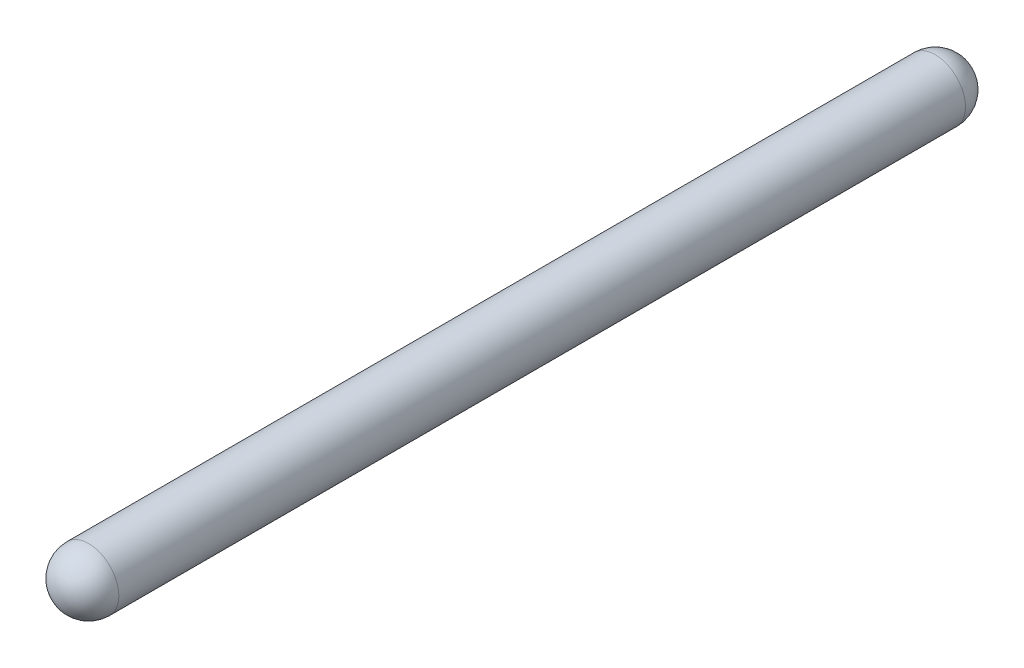
ISO-10303-21;
HEADER;
FILE_DESCRIPTION(('STEP AP214'),'2;1');
FILE_NAME('part.step','',(''),(''),'','','');
FILE_SCHEMA(('AUTOMOTIVE_DESIGN { 1 0 10303 214 1 1 1 1 }'));
ENDSEC;
DATA;
#1=APPLICATION_CONTEXT('core data for automotive mechanical design processes');
#2=APPLICATION_PROTOCOL_DEFINITION('international standard','automotive_design',2000,#1);
#3=PRODUCT_CONTEXT('',#1,'mechanical');
#4=PRODUCT('Part','Part','',(#3));
#5=PRODUCT_RELATED_PRODUCT_CATEGORY('part','',(#4));
#6=PRODUCT_DEFINITION_FORMATION('','',#4);
#7=PRODUCT_DEFINITION_CONTEXT('part definition',#1,'design');
#8=PRODUCT_DEFINITION('design','',#6,#7);
#9=PRODUCT_DEFINITION_SHAPE('','',#8);
#10=(LENGTH_UNIT() NAMED_UNIT(*) SI_UNIT(.MILLI.,.METRE.));
#11=(NAMED_UNIT(*) PLANE_ANGLE_UNIT() SI_UNIT($,.RADIAN.));
#12=(NAMED_UNIT(*) SI_UNIT($,.STERADIAN.) SOLID_ANGLE_UNIT());
#13=UNCERTAINTY_MEASURE_WITH_UNIT(LENGTH_MEASURE(1.E-05),#10,'distance_accuracy_value','');
#14=(GEOMETRIC_REPRESENTATION_CONTEXT(3) GLOBAL_UNCERTAINTY_ASSIGNED_CONTEXT((#13)) GLOBAL_UNIT_ASSIGNED_CONTEXT((#10,
#11,#12)) REPRESENTATION_CONTEXT('',''));
#15=CARTESIAN_POINT('',(0.,0.,0.));
#16=DIRECTION('',(0.,0.,1.));
#17=DIRECTION('',(1.,0.,0.));
#18=AXIS2_PLACEMENT_3D('',#15,#16,#17);
#19=CARTESIAN_POINT('',(0.,0.,22.5));
#20=DIRECTION('',(0.,0.,-1.));
#21=DIRECTION('',(-1.,0.,0.));
#22=AXIS2_PLACEMENT_3D('',#19,#20,#21);
#23=CYLINDRICAL_SURFACE('',#22,0.5);
#24=CARTESIAN_POINT('',(0.,0.,8.));
#25=DIRECTION('',(0.,0.,-1.));
#26=DIRECTION('',(-1.,0.,0.));
#27=AXIS2_PLACEMENT_3D('',#24,#25,#26);
#28=CIRCLE('',#27,0.5);
#29=CARTESIAN_POINT('',(-0.5,0.,8.));
#30=VERTEX_POINT('',#29);
#31=EDGE_CURVE('E10',#30,#30,#28,.F.);
#32=ORIENTED_EDGE('',*,*,#31,.T.);
#33=EDGE_LOOP('',(#32));
#34=FACE_BOUND('',#33,.T.);
#35=CARTESIAN_POINT('',(0.,0.,22.));
#36=DIRECTION('',(0.,0.,-1.));
#37=DIRECTION('',(-1.,0.,0.));
#38=AXIS2_PLACEMENT_3D('',#35,#36,#37);
#39=CIRCLE('',#38,0.5);
#40=CARTESIAN_POINT('',(-0.5,0.,22.));
#41=VERTEX_POINT('',#40);
#42=EDGE_CURVE('E44',#41,#41,#39,.T.);
#43=ORIENTED_EDGE('',*,*,#42,.T.);
#44=EDGE_LOOP('',(#43));
#45=FACE_BOUND('',#44,.T.);
#46=ADVANCED_FACE('F36',(#34,#45),#23,.T.);
#47=CARTESIAN_POINT('',(0.,0.,8.));
#48=DIRECTION('',(0.,0.,1.));
#49=DIRECTION('',(1.,0.,0.));
#50=AXIS2_PLACEMENT_3D('',#47,#48,#49);
#51=SPHERICAL_SURFACE('',#50,0.5);
#52=ORIENTED_EDGE('',*,*,#31,.F.);
#53=EDGE_LOOP('',(#52));
#54=FACE_BOUND('',#53,.T.);
#55=ADVANCED_FACE('F53',(#54),#51,.T.);
#56=CARTESIAN_POINT('',(0.,0.,22.));
#57=DIRECTION('',(0.,0.,1.));
#58=DIRECTION('',(1.,0.,0.));
#59=AXIS2_PLACEMENT_3D('',#56,#57,#58);
#60=SPHERICAL_SURFACE('',#59,0.5);
#61=ORIENTED_EDGE('',*,*,#42,.F.);
#62=EDGE_LOOP('',(#61));
#63=FACE_BOUND('',#62,.T.);
#64=ADVANCED_FACE('F38',(#63),#60,.T.);
#65=CLOSED_SHELL('',(#46,#55,#64));
#66=MANIFOLD_SOLID_BREP('B2',#65);
#67=ADVANCED_BREP_SHAPE_REPRESENTATION('',(#18,#66),#14);
#68=SHAPE_DEFINITION_REPRESENTATION(#9,#67);
ENDSEC;
END-ISO-10303-21;
